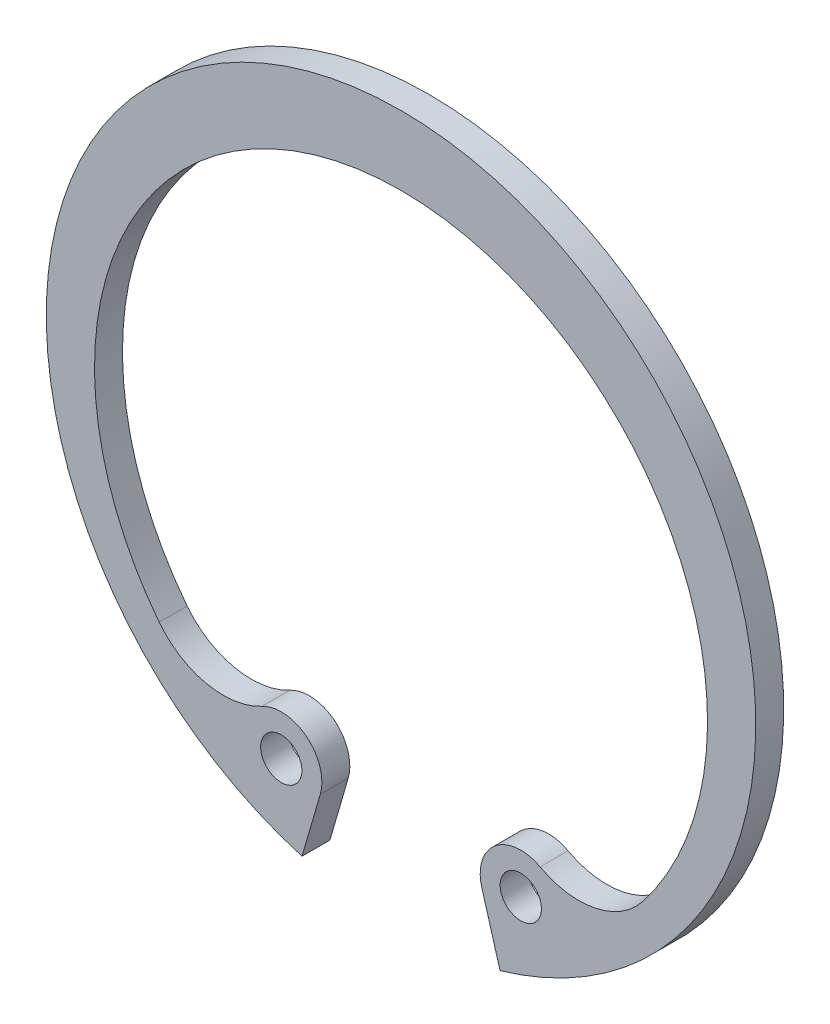
ISO-10303-21;
HEADER;
FILE_DESCRIPTION(('STEP AP214'),'2;1');
FILE_NAME('part.step','',(''),(''),'','','');
FILE_SCHEMA(('AUTOMOTIVE_DESIGN { 1 0 10303 214 1 1 1 1 }'));
ENDSEC;
DATA;
#1=APPLICATION_CONTEXT('core data for automotive mechanical design processes');
#2=APPLICATION_PROTOCOL_DEFINITION('international standard','automotive_design',2000,#1);
#3=PRODUCT_CONTEXT('',#1,'mechanical');
#4=PRODUCT('Part','Part','',(#3));
#5=PRODUCT_RELATED_PRODUCT_CATEGORY('part','',(#4));
#6=PRODUCT_DEFINITION_FORMATION('','',#4);
#7=PRODUCT_DEFINITION_CONTEXT('part definition',#1,'design');
#8=PRODUCT_DEFINITION('design','',#6,#7);
#9=PRODUCT_DEFINITION_SHAPE('','',#8);
#10=(LENGTH_UNIT() NAMED_UNIT(*) SI_UNIT(.MILLI.,.METRE.));
#11=(NAMED_UNIT(*) PLANE_ANGLE_UNIT() SI_UNIT($,.RADIAN.));
#12=(NAMED_UNIT(*) SI_UNIT($,.STERADIAN.) SOLID_ANGLE_UNIT());
#13=UNCERTAINTY_MEASURE_WITH_UNIT(LENGTH_MEASURE(1.E-05),#10,'distance_accuracy_value','');
#14=(GEOMETRIC_REPRESENTATION_CONTEXT(3) GLOBAL_UNCERTAINTY_ASSIGNED_CONTEXT((#13)) GLOBAL_UNIT_ASSIGNED_CONTEXT((#10,
#11,#12)) REPRESENTATION_CONTEXT('',''));
#15=CARTESIAN_POINT('',(0.,0.,0.));
#16=DIRECTION('',(0.,0.,1.));
#17=DIRECTION('',(1.,0.,0.));
#18=AXIS2_PLACEMENT_3D('',#15,#16,#17);
#19=CARTESIAN_POINT('',(0.,0.,-1.0668));
#20=DIRECTION('',(0.,0.,1.));
#21=DIRECTION('',(1.,0.,0.));
#22=AXIS2_PLACEMENT_3D('',#19,#20,#21);
#23=CYLINDRICAL_SURFACE('',#22,13.5382);
#24=CARTESIAN_POINT('',(0.,0.,0.));
#25=DIRECTION('',(0.,0.,1.));
#26=DIRECTION('',(1.,0.,0.));
#27=AXIS2_PLACEMENT_3D('',#24,#25,#26);
#28=CIRCLE('',#27,13.5382);
#29=CARTESIAN_POINT('',(3.77933617363001,-12.9999798971649,0.));
#30=VERTEX_POINT('',#29);
#31=CARTESIAN_POINT('',(-3.77933617363001,-12.9999798971649,0.));
#32=VERTEX_POINT('',#31);
#33=EDGE_CURVE('E129',#30,#32,#28,.T.);
#34=ORIENTED_EDGE('',*,*,#33,.F.);
#35=DIRECTION('',(0.,0.,1.));
#36=VECTOR('',#35,1.);
#37=CARTESIAN_POINT('',(3.77933617363001,-12.9999798971649,-1.0668));
#38=LINE('',#37,#36);
#39=CARTESIAN_POINT('',(3.77933617363001,-12.9999798971649,-1.0668));
#40=VERTEX_POINT('',#39);
#41=EDGE_CURVE('E11',#40,#30,#38,.T.);
#42=ORIENTED_EDGE('',*,*,#41,.F.);
#43=CARTESIAN_POINT('',(0.,0.,-1.0668));
#44=DIRECTION('',(0.,0.,1.));
#45=DIRECTION('',(1.,0.,0.));
#46=AXIS2_PLACEMENT_3D('',#43,#44,#45);
#47=CIRCLE('',#46,13.5382);
#48=CARTESIAN_POINT('',(-3.77933617363001,-12.9999798971649,-1.0668));
#49=VERTEX_POINT('',#48);
#50=EDGE_CURVE('E150',#40,#49,#47,.T.);
#51=ORIENTED_EDGE('',*,*,#50,.T.);
#52=DIRECTION('',(0.,0.,1.));
#53=VECTOR('',#52,1.);
#54=CARTESIAN_POINT('',(-3.77933617363001,-12.9999798971649,-1.0668));
#55=LINE('',#54,#53);
#56=EDGE_CURVE('E35',#49,#32,#55,.T.);
#57=ORIENTED_EDGE('',*,*,#56,.T.);
#58=EDGE_LOOP('',(#34,#42,#51,#57));
#59=FACE_BOUND('',#58,.T.);
#60=ADVANCED_FACE('F32',(#59),#23,.T.);
#61=CARTESIAN_POINT('',(3.77933617363001,-12.9999798971649,-1.0668));
#62=DIRECTION('',(-0.960244338033484,-0.279160905706075,0.));
#63=DIRECTION('',(0.279160905706075,-0.960244338033484,0.));
#64=AXIS2_PLACEMENT_3D('',#61,#62,#63);
#65=PLANE('',#64);
#66=DIRECTION('',(0.279160905706075,-0.960244338033484,0.));
#67=VECTOR('',#66,1.);
#68=CARTESIAN_POINT('',(3.77933617363001,-12.9999798971649,0.));
#69=LINE('',#68,#67);
#70=CARTESIAN_POINT('',(3.0826145033344,-10.6034300027789,0.));
#71=VERTEX_POINT('',#70);
#72=EDGE_CURVE('E148',#71,#30,#69,.T.);
#73=ORIENTED_EDGE('',*,*,#72,.F.);
#74=DIRECTION('',(0.,0.,1.));
#75=VECTOR('',#74,1.);
#76=CARTESIAN_POINT('',(3.0826145033344,-10.6034300027789,-1.0668));
#77=LINE('',#76,#75);
#78=CARTESIAN_POINT('',(3.0826145033344,-10.6034300027789,-1.0668));
#79=VERTEX_POINT('',#78);
#80=EDGE_CURVE('E41',#79,#71,#77,.T.);
#81=ORIENTED_EDGE('',*,*,#80,.F.);
#82=DIRECTION('',(0.279160905706075,-0.960244338033484,0.));
#83=VECTOR('',#82,1.);
#84=CARTESIAN_POINT('',(3.77933617363001,-12.9999798971649,-1.0668));
#85=LINE('',#84,#83);
#86=EDGE_CURVE('E119',#79,#40,#85,.T.);
#87=ORIENTED_EDGE('',*,*,#86,.T.);
#88=ORIENTED_EDGE('',*,*,#41,.T.);
#89=EDGE_LOOP('',(#73,#81,#87,#88));
#90=FACE_BOUND('',#89,.T.);
#91=ADVANCED_FACE('F162',(#90),#65,.T.);
#92=CARTESIAN_POINT('',(4.57041708068348,-10.1708980954779,-1.0668));
#93=DIRECTION('',(0.,0.,1.));
#94=DIRECTION('',(1.,0.,0.));
#95=AXIS2_PLACEMENT_3D('',#92,#93,#94);
#96=CYLINDRICAL_SURFACE('',#95,1.5494);
#97=CARTESIAN_POINT('',(4.57041708068348,-10.1708980954779,0.));
#98=DIRECTION('',(0.,0.,1.));
#99=DIRECTION('',(1.,0.,0.));
#100=AXIS2_PLACEMENT_3D('',#97,#98,#99);
#101=CIRCLE('',#100,1.5494);
#102=CARTESIAN_POINT('',(5.30853516804255,-8.80861249799355,0.));
#103=VERTEX_POINT('',#102);
#104=EDGE_CURVE('E106',#103,#71,#101,.T.);
#105=ORIENTED_EDGE('',*,*,#104,.F.);
#106=DIRECTION('',(0.,0.,1.));
#107=VECTOR('',#106,1.);
#108=CARTESIAN_POINT('',(5.30853516804255,-8.80861249799355,-1.0668));
#109=LINE('',#108,#107);
#110=CARTESIAN_POINT('',(5.30853516804255,-8.80861249799355,-1.0668));
#111=VERTEX_POINT('',#110);
#112=EDGE_CURVE('E101',#111,#103,#109,.T.);
#113=ORIENTED_EDGE('',*,*,#112,.F.);
#114=CARTESIAN_POINT('',(4.57041708068348,-10.1708980954779,-1.0668));
#115=DIRECTION('',(0.,0.,1.));
#116=DIRECTION('',(1.,0.,0.));
#117=AXIS2_PLACEMENT_3D('',#114,#115,#116);
#118=CIRCLE('',#117,1.5494);
#119=EDGE_CURVE('E104',#111,#79,#118,.T.);
#120=ORIENTED_EDGE('',*,*,#119,.T.);
#121=ORIENTED_EDGE('',*,*,#80,.T.);
#122=EDGE_LOOP('',(#105,#113,#120,#121));
#123=FACE_BOUND('',#122,.T.);
#124=ADVANCED_FACE('F103',(#123),#96,.T.);
#125=CARTESIAN_POINT('',(6.78477134276068,-6.08404130302477,-1.0668));
#126=DIRECTION('',(0.,0.,1.));
#127=DIRECTION('',(1.,0.,0.));
#128=AXIS2_PLACEMENT_3D('',#125,#126,#127);
#129=CYLINDRICAL_SURFACE('',#128,3.0988);
#130=CARTESIAN_POINT('',(6.78477134276068,-6.08404130302477,0.));
#131=DIRECTION('',(0.,0.,-1.));
#132=DIRECTION('',(1.,0.,0.));
#133=AXIS2_PLACEMENT_3D('',#130,#131,#132);
#134=CIRCLE('',#133,3.0988);
#135=CARTESIAN_POINT('',(9.22979529673202,-7.98783207527531,0.));
#136=VERTEX_POINT('',#135);
#137=EDGE_CURVE('E145',#136,#103,#134,.T.);
#138=ORIENTED_EDGE('',*,*,#137,.F.);
#139=DIRECTION('',(0.,0.,1.));
#140=VECTOR('',#139,1.);
#141=CARTESIAN_POINT('',(9.22979529673202,-7.98783207527531,-1.0668));
#142=LINE('',#141,#140);
#143=CARTESIAN_POINT('',(9.22979529673202,-7.98783207527531,-1.0668));
#144=VERTEX_POINT('',#143);
#145=EDGE_CURVE('E111',#144,#136,#142,.T.);
#146=ORIENTED_EDGE('',*,*,#145,.F.);
#147=CARTESIAN_POINT('',(6.78477134276068,-6.08404130302477,-1.0668));
#148=DIRECTION('',(0.,0.,-1.));
#149=DIRECTION('',(1.,0.,0.));
#150=AXIS2_PLACEMENT_3D('',#147,#148,#149);
#151=CIRCLE('',#150,3.0988);
#152=EDGE_CURVE('E117',#144,#111,#151,.T.);
#153=ORIENTED_EDGE('',*,*,#152,.T.);
#154=ORIENTED_EDGE('',*,*,#112,.T.);
#155=EDGE_LOOP('',(#138,#146,#153,#154));
#156=FACE_BOUND('',#155,.T.);
#157=ADVANCED_FACE('F121',(#156),#129,.F.);
#158=CARTESIAN_POINT('',(0.,-0.801154379484628,-1.0668));
#159=DIRECTION('',(0.,0.,1.));
#160=DIRECTION('',(1.,0.,0.));
#161=AXIS2_PLACEMENT_3D('',#158,#159,#160);
#162=CYLINDRICAL_SURFACE('',#161,11.6977543794846);
#163=CARTESIAN_POINT('',(0.,-0.801154379484628,0.));
#164=DIRECTION('',(0.,0.,-1.));
#165=DIRECTION('',(1.,0.,0.));
#166=AXIS2_PLACEMENT_3D('',#163,#164,#165);
#167=CIRCLE('',#166,11.6977543794846);
#168=CARTESIAN_POINT('',(-9.22979529673202,-7.98783207527531,0.));
#169=VERTEX_POINT('',#168);
#170=EDGE_CURVE('E142',#169,#136,#167,.T.);
#171=ORIENTED_EDGE('',*,*,#170,.F.);
#172=DIRECTION('',(0.,0.,1.));
#173=VECTOR('',#172,1.);
#174=CARTESIAN_POINT('',(-9.22979529673202,-7.98783207527531,-1.0668));
#175=LINE('',#174,#173);
#176=CARTESIAN_POINT('',(-9.22979529673202,-7.98783207527531,-1.0668));
#177=VERTEX_POINT('',#176);
#178=EDGE_CURVE('E154',#177,#169,#175,.T.);
#179=ORIENTED_EDGE('',*,*,#178,.F.);
#180=CARTESIAN_POINT('',(0.,-0.801154379484628,-1.0668));
#181=DIRECTION('',(0.,0.,-1.));
#182=DIRECTION('',(1.,0.,0.));
#183=AXIS2_PLACEMENT_3D('',#180,#181,#182);
#184=CIRCLE('',#183,11.6977543794846);
#185=EDGE_CURVE('E122',#177,#144,#184,.T.);
#186=ORIENTED_EDGE('',*,*,#185,.T.);
#187=ORIENTED_EDGE('',*,*,#145,.T.);
#188=EDGE_LOOP('',(#171,#179,#186,#187));
#189=FACE_BOUND('',#188,.T.);
#190=ADVANCED_FACE('F175',(#189),#162,.F.);
#191=CARTESIAN_POINT('',(-6.78477134276067,-6.08404130302478,-1.0668));
#192=DIRECTION('',(0.,0.,1.));
#193=DIRECTION('',(1.,0.,0.));
#194=AXIS2_PLACEMENT_3D('',#191,#192,#193);
#195=CYLINDRICAL_SURFACE('',#194,3.0988);
#196=CARTESIAN_POINT('',(-6.78477134276067,-6.08404130302478,0.));
#197=DIRECTION('',(0.,0.,-1.));
#198=DIRECTION('',(1.,0.,0.));
#199=AXIS2_PLACEMENT_3D('',#196,#197,#198);
#200=CIRCLE('',#199,3.0988);
#201=CARTESIAN_POINT('',(-5.30853516804254,-8.80861249799355,0.));
#202=VERTEX_POINT('',#201);
#203=EDGE_CURVE('E139',#202,#169,#200,.T.);
#204=ORIENTED_EDGE('',*,*,#203,.F.);
#205=DIRECTION('',(0.,0.,1.));
#206=VECTOR('',#205,1.);
#207=CARTESIAN_POINT('',(-5.30853516804254,-8.80861249799355,-1.0668));
#208=LINE('',#207,#206);
#209=CARTESIAN_POINT('',(-5.30853516804254,-8.80861249799355,-1.0668));
#210=VERTEX_POINT('',#209);
#211=EDGE_CURVE('E156',#210,#202,#208,.T.);
#212=ORIENTED_EDGE('',*,*,#211,.F.);
#213=CARTESIAN_POINT('',(-6.78477134276067,-6.08404130302478,-1.0668));
#214=DIRECTION('',(0.,0.,-1.));
#215=DIRECTION('',(1.,0.,0.));
#216=AXIS2_PLACEMENT_3D('',#213,#214,#215);
#217=CIRCLE('',#216,3.0988);
#218=EDGE_CURVE('E124',#210,#177,#217,.T.);
#219=ORIENTED_EDGE('',*,*,#218,.T.);
#220=ORIENTED_EDGE('',*,*,#178,.T.);
#221=EDGE_LOOP('',(#204,#212,#219,#220));
#222=FACE_BOUND('',#221,.T.);
#223=ADVANCED_FACE('F178',(#222),#195,.F.);
#224=CARTESIAN_POINT('',(-4.57041708068348,-10.1708980954779,-1.0668));
#225=DIRECTION('',(0.,0.,1.));
#226=DIRECTION('',(1.,0.,0.));
#227=AXIS2_PLACEMENT_3D('',#224,#225,#226);
#228=CYLINDRICAL_SURFACE('',#227,1.5494);
#229=CARTESIAN_POINT('',(-4.57041708068348,-10.1708980954779,0.));
#230=DIRECTION('',(0.,0.,1.));
#231=DIRECTION('',(1.,0.,0.));
#232=AXIS2_PLACEMENT_3D('',#229,#230,#231);
#233=CIRCLE('',#232,1.5494);
#234=CARTESIAN_POINT('',(-3.0826145033344,-10.6034300027789,0.));
#235=VERTEX_POINT('',#234);
#236=EDGE_CURVE('E136',#235,#202,#233,.T.);
#237=ORIENTED_EDGE('',*,*,#236,.F.);
#238=DIRECTION('',(0.,0.,1.));
#239=VECTOR('',#238,1.);
#240=CARTESIAN_POINT('',(-3.0826145033344,-10.6034300027789,-1.0668));
#241=LINE('',#240,#239);
#242=CARTESIAN_POINT('',(-3.0826145033344,-10.6034300027789,-1.0668));
#243=VERTEX_POINT('',#242);
#244=EDGE_CURVE('E157',#243,#235,#241,.T.);
#245=ORIENTED_EDGE('',*,*,#244,.F.);
#246=CARTESIAN_POINT('',(-4.57041708068348,-10.1708980954779,-1.0668));
#247=DIRECTION('',(0.,0.,1.));
#248=DIRECTION('',(1.,0.,0.));
#249=AXIS2_PLACEMENT_3D('',#246,#247,#248);
#250=CIRCLE('',#249,1.5494);
#251=EDGE_CURVE('E224',#243,#210,#250,.T.);
#252=ORIENTED_EDGE('',*,*,#251,.T.);
#253=ORIENTED_EDGE('',*,*,#211,.T.);
#254=EDGE_LOOP('',(#237,#245,#252,#253));
#255=FACE_BOUND('',#254,.T.);
#256=ADVANCED_FACE('F182',(#255),#228,.T.);
#257=CARTESIAN_POINT('',(-3.77933617363001,-12.9999798971649,-1.0668));
#258=DIRECTION('',(0.960244338033484,-0.279160905706077,0.));
#259=DIRECTION('',(0.279160905706077,0.960244338033484,0.));
#260=AXIS2_PLACEMENT_3D('',#257,#258,#259);
#261=PLANE('',#260);
#262=DIRECTION('',(0.279160905706077,0.960244338033484,0.));
#263=VECTOR('',#262,1.);
#264=CARTESIAN_POINT('',(-3.77933617363001,-12.9999798971649,0.));
#265=LINE('',#264,#263);
#266=EDGE_CURVE('E132',#32,#235,#265,.T.);
#267=ORIENTED_EDGE('',*,*,#266,.F.);
#268=ORIENTED_EDGE('',*,*,#56,.F.);
#269=DIRECTION('',(0.279160905706077,0.960244338033484,0.));
#270=VECTOR('',#269,1.);
#271=CARTESIAN_POINT('',(-3.77933617363001,-12.9999798971649,-1.0668));
#272=LINE('',#271,#270);
#273=EDGE_CURVE('E222',#49,#243,#272,.T.);
#274=ORIENTED_EDGE('',*,*,#273,.T.);
#275=ORIENTED_EDGE('',*,*,#244,.T.);
#276=EDGE_LOOP('',(#267,#268,#274,#275));
#277=FACE_BOUND('',#276,.T.);
#278=ADVANCED_FACE('F159',(#277),#261,.T.);
#279=CARTESIAN_POINT('',(0.,0.,-1.0668));
#280=DIRECTION('',(0.,0.,1.));
#281=DIRECTION('',(1.,0.,0.));
#282=AXIS2_PLACEMENT_3D('',#279,#280,#281);
#283=PLANE('',#282);
#284=CARTESIAN_POINT('',(-4.57041708068348,-10.1708980954779,-1.0668));
#285=DIRECTION('',(0.,0.,1.));
#286=DIRECTION('',(1.,0.,0.));
#287=AXIS2_PLACEMENT_3D('',#284,#285,#286);
#288=CIRCLE('',#287,0.787399999999998);
#289=CARTESIAN_POINT('',(-3.78301708068348,-10.1708980954779,-1.0668));
#290=VERTEX_POINT('',#289);
#291=EDGE_CURVE('E209',#290,#290,#288,.T.);
#292=ORIENTED_EDGE('',*,*,#291,.T.);
#293=EDGE_LOOP('',(#292));
#294=FACE_BOUND('',#293,.T.);
#295=CARTESIAN_POINT('',(4.57041708068348,-10.1708980954779,-1.0668));
#296=DIRECTION('',(0.,0.,1.));
#297=DIRECTION('',(1.,0.,0.));
#298=AXIS2_PLACEMENT_3D('',#295,#296,#297);
#299=CIRCLE('',#298,0.787399999999999);
#300=CARTESIAN_POINT('',(5.35781708068348,-10.1708980954779,-1.0668));
#301=VERTEX_POINT('',#300);
#302=EDGE_CURVE('E133',#301,#301,#299,.T.);
#303=ORIENTED_EDGE('',*,*,#302,.T.);
#304=EDGE_LOOP('',(#303));
#305=FACE_BOUND('',#304,.T.);
#306=ORIENTED_EDGE('',*,*,#50,.F.);
#307=ORIENTED_EDGE('',*,*,#86,.F.);
#308=ORIENTED_EDGE('',*,*,#119,.F.);
#309=ORIENTED_EDGE('',*,*,#152,.F.);
#310=ORIENTED_EDGE('',*,*,#185,.F.);
#311=ORIENTED_EDGE('',*,*,#218,.F.);
#312=ORIENTED_EDGE('',*,*,#251,.F.);
#313=ORIENTED_EDGE('',*,*,#273,.F.);
#314=EDGE_LOOP('',(#306,#307,#308,#309,#310,#311,#312,#313));
#315=FACE_BOUND('',#314,.T.);
#316=ADVANCED_FACE('F115',(#294,#305,#315),#283,.F.);
#317=CARTESIAN_POINT('',(0.,0.,0.));
#318=DIRECTION('',(0.,0.,1.));
#319=DIRECTION('',(1.,0.,0.));
#320=AXIS2_PLACEMENT_3D('',#317,#318,#319);
#321=PLANE('',#320);
#322=CARTESIAN_POINT('',(-4.57041708068348,-10.1708980954779,0.));
#323=DIRECTION('',(0.,0.,1.));
#324=DIRECTION('',(1.,0.,0.));
#325=AXIS2_PLACEMENT_3D('',#322,#323,#324);
#326=CIRCLE('',#325,0.787399999999998);
#327=CARTESIAN_POINT('',(-3.78301708068348,-10.1708980954779,0.));
#328=VERTEX_POINT('',#327);
#329=EDGE_CURVE('E212',#328,#328,#326,.T.);
#330=ORIENTED_EDGE('',*,*,#329,.F.);
#331=EDGE_LOOP('',(#330));
#332=FACE_BOUND('',#331,.T.);
#333=CARTESIAN_POINT('',(4.57041708068348,-10.1708980954779,0.));
#334=DIRECTION('',(0.,0.,1.));
#335=DIRECTION('',(1.,0.,0.));
#336=AXIS2_PLACEMENT_3D('',#333,#334,#335);
#337=CIRCLE('',#336,0.787399999999999);
#338=CARTESIAN_POINT('',(5.35781708068348,-10.1708980954779,0.));
#339=VERTEX_POINT('',#338);
#340=EDGE_CURVE('E214',#339,#339,#337,.T.);
#341=ORIENTED_EDGE('',*,*,#340,.F.);
#342=EDGE_LOOP('',(#341));
#343=FACE_BOUND('',#342,.T.);
#344=ORIENTED_EDGE('',*,*,#33,.T.);
#345=ORIENTED_EDGE('',*,*,#266,.T.);
#346=ORIENTED_EDGE('',*,*,#236,.T.);
#347=ORIENTED_EDGE('',*,*,#203,.T.);
#348=ORIENTED_EDGE('',*,*,#170,.T.);
#349=ORIENTED_EDGE('',*,*,#137,.T.);
#350=ORIENTED_EDGE('',*,*,#104,.T.);
#351=ORIENTED_EDGE('',*,*,#72,.T.);
#352=EDGE_LOOP('',(#344,#345,#346,#347,#348,#349,#350,#351));
#353=FACE_BOUND('',#352,.T.);
#354=ADVANCED_FACE('F161',(#332,#343,#353),#321,.T.);
#355=CARTESIAN_POINT('',(4.57041708068348,-10.1708980954779,-1.0668));
#356=DIRECTION('',(0.,0.,1.));
#357=DIRECTION('',(1.,0.,0.));
#358=AXIS2_PLACEMENT_3D('',#355,#356,#357);
#359=CYLINDRICAL_SURFACE('',#358,0.787399999999999);
#360=ORIENTED_EDGE('',*,*,#302,.F.);
#361=EDGE_LOOP('',(#360));
#362=FACE_BOUND('',#361,.T.);
#363=ORIENTED_EDGE('',*,*,#340,.T.);
#364=EDGE_LOOP('',(#363));
#365=FACE_BOUND('',#364,.T.);
#366=ADVANCED_FACE('F194',(#362,#365),#359,.F.);
#367=CARTESIAN_POINT('',(-4.57041708068348,-10.1708980954779,-1.0668));
#368=DIRECTION('',(0.,0.,1.));
#369=DIRECTION('',(1.,0.,0.));
#370=AXIS2_PLACEMENT_3D('',#367,#368,#369);
#371=CYLINDRICAL_SURFACE('',#370,0.787399999999998);
#372=ORIENTED_EDGE('',*,*,#291,.F.);
#373=EDGE_LOOP('',(#372));
#374=FACE_BOUND('',#373,.T.);
#375=ORIENTED_EDGE('',*,*,#329,.T.);
#376=EDGE_LOOP('',(#375));
#377=FACE_BOUND('',#376,.T.);
#378=ADVANCED_FACE('F201',(#374,#377),#371,.F.);
#379=CLOSED_SHELL('',(#60,#91,#124,#157,#190,#223,#256,#278,#316,#354,#366,#378));
#380=MANIFOLD_SOLID_BREP('B2',#379);
#381=ADVANCED_BREP_SHAPE_REPRESENTATION('',(#18,#380),#14);
#382=SHAPE_DEFINITION_REPRESENTATION(#9,#381);
ENDSEC;
END-ISO-10303-21;
